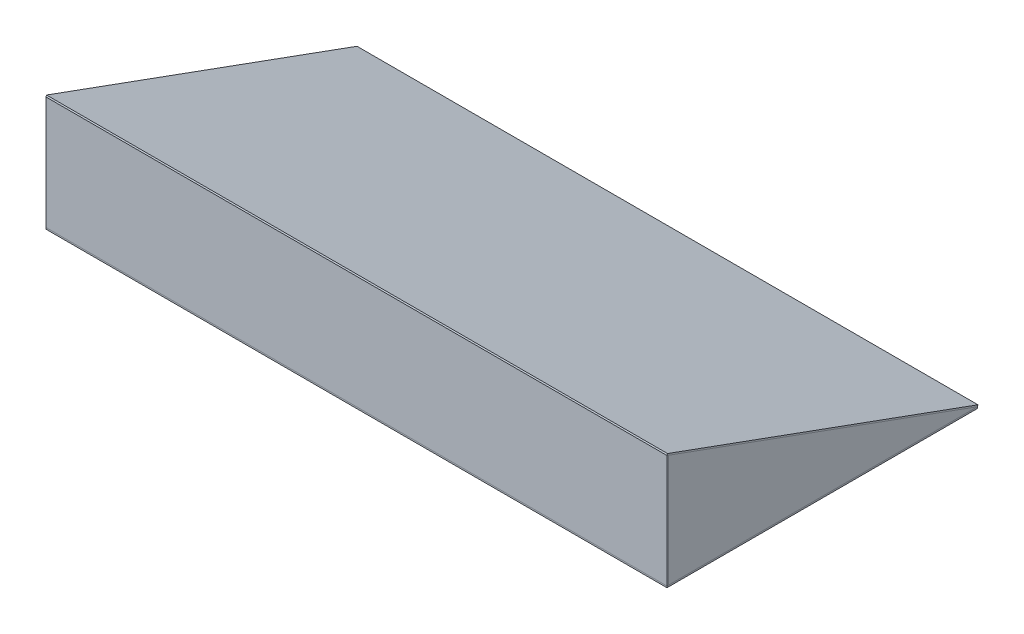
ISO-10303-21;
HEADER;
FILE_DESCRIPTION(('STEP AP214'),'2;1');
FILE_NAME('part.step','',(''),(''),'','','');
FILE_SCHEMA(('AUTOMOTIVE_DESIGN { 1 0 10303 214 1 1 1 1 }'));
ENDSEC;
DATA;
#1=APPLICATION_CONTEXT('core data for automotive mechanical design processes');
#2=APPLICATION_PROTOCOL_DEFINITION('international standard','automotive_design',2000,#1);
#3=PRODUCT_CONTEXT('',#1,'mechanical');
#4=PRODUCT('Part','Part','',(#3));
#5=PRODUCT_RELATED_PRODUCT_CATEGORY('part','',(#4));
#6=PRODUCT_DEFINITION_FORMATION('','',#4);
#7=PRODUCT_DEFINITION_CONTEXT('part definition',#1,'design');
#8=PRODUCT_DEFINITION('design','',#6,#7);
#9=PRODUCT_DEFINITION_SHAPE('','',#8);
#10=(LENGTH_UNIT() NAMED_UNIT(*) SI_UNIT(.MILLI.,.METRE.));
#11=(NAMED_UNIT(*) PLANE_ANGLE_UNIT() SI_UNIT($,.RADIAN.));
#12=(NAMED_UNIT(*) SI_UNIT($,.STERADIAN.) SOLID_ANGLE_UNIT());
#13=UNCERTAINTY_MEASURE_WITH_UNIT(LENGTH_MEASURE(1.E-05),#10,'distance_accuracy_value','');
#14=(GEOMETRIC_REPRESENTATION_CONTEXT(3) GLOBAL_UNCERTAINTY_ASSIGNED_CONTEXT((#13)) GLOBAL_UNIT_ASSIGNED_CONTEXT((#10,
#11,#12)) REPRESENTATION_CONTEXT('',''));
#15=CARTESIAN_POINT('',(0.,0.,0.));
#16=DIRECTION('',(0.,0.,1.));
#17=DIRECTION('',(1.,0.,0.));
#18=AXIS2_PLACEMENT_3D('',#15,#16,#17);
#19=CARTESIAN_POINT('',(299.2634,0.,-150.));
#20=DIRECTION('',(0.,-1.,0.));
#21=DIRECTION('',(0.,0.,-1.));
#22=AXIS2_PLACEMENT_3D('',#19,#20,#21);
#23=PLANE('',#22);
#24=DIRECTION('',(0.,0.,-1.));
#25=VECTOR('',#24,1.);
#26=CARTESIAN_POINT('',(300.,0.,-150.));
#27=LINE('',#26,#25);
#28=CARTESIAN_POINT('',(300.,0.,-0.7366));
#29=VERTEX_POINT('',#28);
#30=CARTESIAN_POINT('',(300.,0.,-150.));
#31=VERTEX_POINT('',#30);
#32=EDGE_CURVE('E103',#29,#31,#27,.T.);
#33=ORIENTED_EDGE('',*,*,#32,.F.);
#34=DIRECTION('',(1.,0.,0.));
#35=VECTOR('',#34,1.);
#36=CARTESIAN_POINT('',(299.2634,0.,-0.7366));
#37=LINE('',#36,#35);
#38=CARTESIAN_POINT('',(299.2634,0.,-0.7366));
#39=VERTEX_POINT('',#38);
#40=EDGE_CURVE('E12',#39,#29,#37,.T.);
#41=ORIENTED_EDGE('',*,*,#40,.F.);
#42=DIRECTION('',(0.,0.,-1.));
#43=VECTOR('',#42,1.);
#44=CARTESIAN_POINT('',(299.2634,0.,-150.));
#45=LINE('',#44,#43);
#46=CARTESIAN_POINT('',(299.2634,0.,-150.));
#47=VERTEX_POINT('',#46);
#48=EDGE_CURVE('E95',#39,#47,#45,.T.);
#49=ORIENTED_EDGE('',*,*,#48,.T.);
#50=DIRECTION('',(1.,0.,0.));
#51=VECTOR('',#50,1.);
#52=CARTESIAN_POINT('',(299.2634,0.,-150.));
#53=LINE('',#52,#51);
#54=EDGE_CURVE('E54',#47,#31,#53,.T.);
#55=ORIENTED_EDGE('',*,*,#54,.T.);
#56=EDGE_LOOP('',(#33,#41,#49,#55));
#57=FACE_BOUND('',#56,.T.);
#58=ADVANCED_FACE('F51',(#57),#23,.T.);
#59=CARTESIAN_POINT('',(299.2634,0.,-0.7366));
#60=DIRECTION('',(0.,0.,1.));
#61=DIRECTION('',(1.,0.,0.));
#62=AXIS2_PLACEMENT_3D('',#59,#60,#61);
#63=PLANE('',#62);
#64=DIRECTION('',(0.,-1.,0.));
#65=VECTOR('',#64,1.);
#66=CARTESIAN_POINT('',(300.,0.,-0.7366));
#67=LINE('',#66,#65);
#68=CARTESIAN_POINT('',(300.,54.5955351399293,-0.7366));
#69=VERTEX_POINT('',#68);
#70=EDGE_CURVE('E97',#69,#29,#67,.T.);
#71=ORIENTED_EDGE('',*,*,#70,.F.);
#72=DIRECTION('',(1.,0.,0.));
#73=VECTOR('',#72,1.);
#74=CARTESIAN_POINT('',(299.2634,54.5955351399293,-0.7366));
#75=LINE('',#74,#73);
#76=CARTESIAN_POINT('',(299.2634,54.5955351399293,-0.7366));
#77=VERTEX_POINT('',#76);
#78=EDGE_CURVE('E60',#77,#69,#75,.T.);
#79=ORIENTED_EDGE('',*,*,#78,.F.);
#80=DIRECTION('',(0.,-1.,0.));
#81=VECTOR('',#80,1.);
#82=CARTESIAN_POINT('',(299.2634,0.,-0.7366));
#83=LINE('',#82,#81);
#84=EDGE_CURVE('E92',#77,#39,#83,.T.);
#85=ORIENTED_EDGE('',*,*,#84,.T.);
#86=ORIENTED_EDGE('',*,*,#40,.T.);
#87=EDGE_LOOP('',(#71,#79,#85,#86));
#88=FACE_BOUND('',#87,.T.);
#89=ADVANCED_FACE('F107',(#88),#63,.T.);
#90=CARTESIAN_POINT('',(299.2634,54.5955351399293,-0.7366));
#91=DIRECTION('',(0.,0.939149294067638,-0.343509247986509));
#92=DIRECTION('',(0.,0.343509247986509,0.939149294067638));
#93=AXIS2_PLACEMENT_3D('',#90,#91,#92);
#94=PLANE('',#93);
#95=DIRECTION('',(0.,0.343509247986509,0.939149294067638));
#96=VECTOR('',#95,1.);
#97=CARTESIAN_POINT('',(300.,54.5955351399293,-0.7366));
#98=LINE('',#97,#96);
#99=EDGE_CURVE('E90',#31,#69,#98,.T.);
#100=ORIENTED_EDGE('',*,*,#99,.F.);
#101=ORIENTED_EDGE('',*,*,#54,.F.);
#102=DIRECTION('',(0.,0.343509247986509,0.939149294067638));
#103=VECTOR('',#102,1.);
#104=CARTESIAN_POINT('',(299.2634,54.5955351399293,-0.7366));
#105=LINE('',#104,#103);
#106=EDGE_CURVE('E88',#47,#77,#105,.T.);
#107=ORIENTED_EDGE('',*,*,#106,.T.);
#108=ORIENTED_EDGE('',*,*,#78,.T.);
#109=EDGE_LOOP('',(#100,#101,#107,#108));
#110=FACE_BOUND('',#109,.T.);
#111=ADVANCED_FACE('F87',(#110),#94,.T.);
#112=CARTESIAN_POINT('',(299.2634,0.,0.));
#113=DIRECTION('',(-1.,0.,0.));
#114=DIRECTION('',(0.,0.,1.));
#115=AXIS2_PLACEMENT_3D('',#112,#113,#114);
#116=PLANE('',#115);
#117=ORIENTED_EDGE('',*,*,#48,.F.);
#118=ORIENTED_EDGE('',*,*,#84,.F.);
#119=ORIENTED_EDGE('',*,*,#106,.F.);
#120=EDGE_LOOP('',(#117,#118,#119));
#121=FACE_BOUND('',#120,.T.);
#122=ADVANCED_FACE('F94',(#121),#116,.T.);
#123=CARTESIAN_POINT('',(300.,0.,0.));
#124=DIRECTION('',(-1.,0.,0.));
#125=DIRECTION('',(0.,0.,1.));
#126=AXIS2_PLACEMENT_3D('',#123,#124,#125);
#127=PLANE('',#126);
#128=ORIENTED_EDGE('',*,*,#32,.T.);
#129=ORIENTED_EDGE('',*,*,#99,.T.);
#130=ORIENTED_EDGE('',*,*,#70,.T.);
#131=EDGE_LOOP('',(#128,#129,#130));
#132=FACE_BOUND('',#131,.T.);
#133=ADVANCED_FACE('F106',(#132),#127,.F.);
#134=CLOSED_SHELL('',(#58,#89,#111,#122,#133));
#135=MANIFOLD_SOLID_BREP('B2',#134);
#136=CARTESIAN_POINT('',(0.7366,0.,-0.7366));
#137=DIRECTION('',(0.,0.,1.));
#138=DIRECTION('',(1.,0.,0.));
#139=AXIS2_PLACEMENT_3D('',#136,#137,#138);
#140=PLANE('',#139);
#141=DIRECTION('',(0.,1.,0.));
#142=VECTOR('',#141,1.);
#143=CARTESIAN_POINT('',(0.,0.,-0.7366));
#144=LINE('',#143,#142);
#145=CARTESIAN_POINT('',(0.,0.,-0.7366));
#146=VERTEX_POINT('',#145);
#147=CARTESIAN_POINT('',(0.,54.5955351399293,-0.7366));
#148=VERTEX_POINT('',#147);
#149=EDGE_CURVE('E220',#146,#148,#144,.T.);
#150=ORIENTED_EDGE('',*,*,#149,.F.);
#151=DIRECTION('',(-1.,0.,0.));
#152=VECTOR('',#151,1.);
#153=CARTESIAN_POINT('',(0.7366,0.,-0.7366));
#154=LINE('',#153,#152);
#155=CARTESIAN_POINT('',(0.7366,0.,-0.7366));
#156=VERTEX_POINT('',#155);
#157=EDGE_CURVE('E49',#156,#146,#154,.T.);
#158=ORIENTED_EDGE('',*,*,#157,.F.);
#159=DIRECTION('',(0.,1.,0.));
#160=VECTOR('',#159,1.);
#161=CARTESIAN_POINT('',(0.7366,0.,-0.7366));
#162=LINE('',#161,#160);
#163=CARTESIAN_POINT('',(0.7366,54.5955351399293,-0.7366));
#164=VERTEX_POINT('',#163);
#165=EDGE_CURVE('E212',#156,#164,#162,.T.);
#166=ORIENTED_EDGE('',*,*,#165,.T.);
#167=DIRECTION('',(-1.,0.,0.));
#168=VECTOR('',#167,1.);
#169=CARTESIAN_POINT('',(0.7366,54.5955351399293,-0.7366));
#170=LINE('',#169,#168);
#171=EDGE_CURVE('E171',#164,#148,#170,.T.);
#172=ORIENTED_EDGE('',*,*,#171,.T.);
#173=EDGE_LOOP('',(#150,#158,#166,#172));
#174=FACE_BOUND('',#173,.T.);
#175=ADVANCED_FACE('F168',(#174),#140,.T.);
#176=CARTESIAN_POINT('',(0.7366,0.,-150.));
#177=DIRECTION('',(0.,-1.,0.));
#178=DIRECTION('',(0.,0.,-1.));
#179=AXIS2_PLACEMENT_3D('',#176,#177,#178);
#180=PLANE('',#179);
#181=DIRECTION('',(0.,0.,1.));
#182=VECTOR('',#181,1.);
#183=CARTESIAN_POINT('',(0.,0.,-150.));
#184=LINE('',#183,#182);
#185=CARTESIAN_POINT('',(0.,0.,-150.));
#186=VERTEX_POINT('',#185);
#187=EDGE_CURVE('E214',#186,#146,#184,.T.);
#188=ORIENTED_EDGE('',*,*,#187,.F.);
#189=DIRECTION('',(-1.,0.,0.));
#190=VECTOR('',#189,1.);
#191=CARTESIAN_POINT('',(0.7366,0.,-150.));
#192=LINE('',#191,#190);
#193=CARTESIAN_POINT('',(0.7366,0.,-150.));
#194=VERTEX_POINT('',#193);
#195=EDGE_CURVE('E177',#194,#186,#192,.T.);
#196=ORIENTED_EDGE('',*,*,#195,.F.);
#197=DIRECTION('',(0.,0.,1.));
#198=VECTOR('',#197,1.);
#199=CARTESIAN_POINT('',(0.7366,0.,-150.));
#200=LINE('',#199,#198);
#201=EDGE_CURVE('E209',#194,#156,#200,.T.);
#202=ORIENTED_EDGE('',*,*,#201,.T.);
#203=ORIENTED_EDGE('',*,*,#157,.T.);
#204=EDGE_LOOP('',(#188,#196,#202,#203));
#205=FACE_BOUND('',#204,.T.);
#206=ADVANCED_FACE('F224',(#205),#180,.T.);
#207=CARTESIAN_POINT('',(0.7366,54.5955351399293,-0.7366));
#208=DIRECTION('',(0.,0.939149294067638,-0.343509247986509));
#209=DIRECTION('',(0.,0.343509247986509,0.939149294067638));
#210=AXIS2_PLACEMENT_3D('',#207,#208,#209);
#211=PLANE('',#210);
#212=DIRECTION('',(0.,-0.343509247986509,-0.939149294067638));
#213=VECTOR('',#212,1.);
#214=CARTESIAN_POINT('',(0.,54.5955351399293,-0.7366));
#215=LINE('',#214,#213);
#216=EDGE_CURVE('E207',#148,#186,#215,.T.);
#217=ORIENTED_EDGE('',*,*,#216,.F.);
#218=ORIENTED_EDGE('',*,*,#171,.F.);
#219=DIRECTION('',(0.,-0.343509247986509,-0.939149294067638));
#220=VECTOR('',#219,1.);
#221=CARTESIAN_POINT('',(0.7366,54.5955351399293,-0.7366));
#222=LINE('',#221,#220);
#223=EDGE_CURVE('E205',#164,#194,#222,.T.);
#224=ORIENTED_EDGE('',*,*,#223,.T.);
#225=ORIENTED_EDGE('',*,*,#195,.T.);
#226=EDGE_LOOP('',(#217,#218,#224,#225));
#227=FACE_BOUND('',#226,.T.);
#228=ADVANCED_FACE('F204',(#227),#211,.T.);
#229=CARTESIAN_POINT('',(0.7366,0.,0.));
#230=DIRECTION('',(1.,0.,0.));
#231=DIRECTION('',(0.,0.,-1.));
#232=AXIS2_PLACEMENT_3D('',#229,#230,#231);
#233=PLANE('',#232);
#234=ORIENTED_EDGE('',*,*,#165,.F.);
#235=ORIENTED_EDGE('',*,*,#201,.F.);
#236=ORIENTED_EDGE('',*,*,#223,.F.);
#237=EDGE_LOOP('',(#234,#235,#236));
#238=FACE_BOUND('',#237,.T.);
#239=ADVANCED_FACE('F211',(#238),#233,.T.);
#240=CARTESIAN_POINT('',(0.,0.,0.));
#241=DIRECTION('',(1.,0.,0.));
#242=DIRECTION('',(0.,0.,-1.));
#243=AXIS2_PLACEMENT_3D('',#240,#241,#242);
#244=PLANE('',#243);
#245=ORIENTED_EDGE('',*,*,#149,.T.);
#246=ORIENTED_EDGE('',*,*,#216,.T.);
#247=ORIENTED_EDGE('',*,*,#187,.T.);
#248=EDGE_LOOP('',(#245,#246,#247));
#249=FACE_BOUND('',#248,.T.);
#250=ADVANCED_FACE('F223',(#249),#244,.F.);
#251=CLOSED_SHELL('',(#175,#206,#228,#239,#250));
#252=MANIFOLD_SOLID_BREP('B6',#251);
#253=CARTESIAN_POINT('',(354.600503997447,0.,-0.7366));
#254=DIRECTION('',(0.,0.,1.));
#255=DIRECTION('',(1.,0.,0.));
#256=AXIS2_PLACEMENT_3D('',#253,#254,#255);
#257=PLANE('',#256);
#258=DIRECTION('',(0.,-1.,0.));
#259=VECTOR('',#258,1.);
#260=CARTESIAN_POINT('',(300.,0.,-0.7366));
#261=LINE('',#260,#259);
#262=CARTESIAN_POINT('',(300.,54.5955351399293,-0.7366));
#263=VERTEX_POINT('',#262);
#264=CARTESIAN_POINT('',(300.,0.,-0.7366));
#265=VERTEX_POINT('',#264);
#266=EDGE_CURVE('E326',#263,#265,#261,.T.);
#267=ORIENTED_EDGE('',*,*,#266,.T.);
#268=DIRECTION('',(-1.,0.,0.));
#269=VECTOR('',#268,1.);
#270=CARTESIAN_POINT('',(354.600503997447,0.,-0.7366));
#271=LINE('',#270,#269);
#272=CARTESIAN_POINT('',(0.,0.,-0.7366));
#273=VERTEX_POINT('',#272);
#274=EDGE_CURVE('E307',#265,#273,#271,.T.);
#275=ORIENTED_EDGE('',*,*,#274,.T.);
#276=DIRECTION('',(0.,1.,0.));
#277=VECTOR('',#276,1.);
#278=CARTESIAN_POINT('',(0.,0.,-0.7366));
#279=LINE('',#278,#277);
#280=CARTESIAN_POINT('',(0.,54.5955351399293,-0.7366));
#281=VERTEX_POINT('',#280);
#282=EDGE_CURVE('E352',#273,#281,#279,.T.);
#283=ORIENTED_EDGE('',*,*,#282,.T.);
#284=DIRECTION('',(-1.,0.,0.));
#285=VECTOR('',#284,1.);
#286=CARTESIAN_POINT('',(354.600503997447,54.5955351399293,-0.7366));
#287=LINE('',#286,#285);
#288=EDGE_CURVE('E166',#263,#281,#287,.T.);
#289=ORIENTED_EDGE('',*,*,#288,.F.);
#290=EDGE_LOOP('',(#267,#275,#283,#289));
#291=FACE_BOUND('',#290,.T.);
#292=ADVANCED_FACE('F285',(#291),#257,.F.);
#293=CARTESIAN_POINT('',(354.600503997447,54.5955351399293,0.));
#294=DIRECTION('',(0.,1.,0.));
#295=DIRECTION('',(0.,0.,1.));
#296=AXIS2_PLACEMENT_3D('',#293,#294,#295);
#297=PLANE('',#296);
#298=DIRECTION('',(-1.,0.,0.));
#299=VECTOR('',#298,1.);
#300=CARTESIAN_POINT('',(354.600503997447,54.5955351399293,0.));
#301=LINE('',#300,#299);
#302=CARTESIAN_POINT('',(300.,54.5955351399293,0.));
#303=VERTEX_POINT('',#302);
#304=CARTESIAN_POINT('',(0.,54.5955351399293,0.));
#305=VERTEX_POINT('',#304);
#306=EDGE_CURVE('E292',#303,#305,#301,.T.);
#307=ORIENTED_EDGE('',*,*,#306,.F.);
#308=DIRECTION('',(0.,0.,-1.));
#309=VECTOR('',#308,1.);
#310=CARTESIAN_POINT('',(300.,54.5955351399293,-0.7366));
#311=LINE('',#310,#309);
#312=EDGE_CURVE('E324',#263,#303,#311,.F.);
#313=ORIENTED_EDGE('',*,*,#312,.F.);
#314=ORIENTED_EDGE('',*,*,#288,.T.);
#315=DIRECTION('',(0.,0.,-1.));
#316=VECTOR('',#315,1.);
#317=CARTESIAN_POINT('',(0.,54.5955351399293,0.));
#318=LINE('',#317,#316);
#319=EDGE_CURVE('E341',#305,#281,#318,.T.);
#320=ORIENTED_EDGE('',*,*,#319,.F.);
#321=EDGE_LOOP('',(#307,#313,#314,#320));
#322=FACE_BOUND('',#321,.T.);
#323=ADVANCED_FACE('F339',(#322),#297,.T.);
#324=CARTESIAN_POINT('',(354.600503997447,0.,0.));
#325=DIRECTION('',(0.,0.,1.));
#326=DIRECTION('',(1.,0.,0.));
#327=AXIS2_PLACEMENT_3D('',#324,#325,#326);
#328=PLANE('',#327);
#329=DIRECTION('',(-1.,0.,0.));
#330=VECTOR('',#329,1.);
#331=CARTESIAN_POINT('',(354.600503997447,0.,0.));
#332=LINE('',#331,#330);
#333=CARTESIAN_POINT('',(300.,0.,0.));
#334=VERTEX_POINT('',#333);
#335=CARTESIAN_POINT('',(0.,0.,0.));
#336=VERTEX_POINT('',#335);
#337=EDGE_CURVE('E337',#334,#336,#332,.T.);
#338=ORIENTED_EDGE('',*,*,#337,.F.);
#339=DIRECTION('',(0.,1.,0.));
#340=VECTOR('',#339,1.);
#341=CARTESIAN_POINT('',(300.,0.,0.));
#342=LINE('',#341,#340);
#343=EDGE_CURVE('E299',#303,#334,#342,.F.);
#344=ORIENTED_EDGE('',*,*,#343,.F.);
#345=ORIENTED_EDGE('',*,*,#306,.T.);
#346=DIRECTION('',(0.,1.,0.));
#347=VECTOR('',#346,1.);
#348=CARTESIAN_POINT('',(0.,0.,0.));
#349=LINE('',#348,#347);
#350=EDGE_CURVE('E349',#336,#305,#349,.T.);
#351=ORIENTED_EDGE('',*,*,#350,.F.);
#352=EDGE_LOOP('',(#338,#344,#345,#351));
#353=FACE_BOUND('',#352,.T.);
#354=ADVANCED_FACE('F334',(#353),#328,.T.);
#355=CARTESIAN_POINT('',(354.600503997447,0.,-0.7366));
#356=DIRECTION('',(0.,-1.,0.));
#357=DIRECTION('',(0.,0.,-1.));
#358=AXIS2_PLACEMENT_3D('',#355,#356,#357);
#359=PLANE('',#358);
#360=ORIENTED_EDGE('',*,*,#274,.F.);
#361=DIRECTION('',(0.,0.,-1.));
#362=VECTOR('',#361,1.);
#363=CARTESIAN_POINT('',(300.,0.,-0.7366));
#364=LINE('',#363,#362);
#365=EDGE_CURVE('E330',#265,#334,#364,.F.);
#366=ORIENTED_EDGE('',*,*,#365,.T.);
#367=ORIENTED_EDGE('',*,*,#337,.T.);
#368=DIRECTION('',(0.,0.,1.));
#369=VECTOR('',#368,1.);
#370=CARTESIAN_POINT('',(0.,0.,-0.7366));
#371=LINE('',#370,#369);
#372=EDGE_CURVE('E346',#273,#336,#371,.T.);
#373=ORIENTED_EDGE('',*,*,#372,.F.);
#374=EDGE_LOOP('',(#360,#366,#367,#373));
#375=FACE_BOUND('',#374,.T.);
#376=ADVANCED_FACE('F357',(#375),#359,.T.);
#377=CARTESIAN_POINT('',(0.,0.,0.));
#378=DIRECTION('',(-1.,0.,0.));
#379=DIRECTION('',(0.,0.,1.));
#380=AXIS2_PLACEMENT_3D('',#377,#378,#379);
#381=PLANE('',#380);
#382=ORIENTED_EDGE('',*,*,#282,.F.);
#383=ORIENTED_EDGE('',*,*,#372,.T.);
#384=ORIENTED_EDGE('',*,*,#350,.T.);
#385=ORIENTED_EDGE('',*,*,#319,.T.);
#386=EDGE_LOOP('',(#382,#383,#384,#385));
#387=FACE_BOUND('',#386,.T.);
#388=ADVANCED_FACE('F359',(#387),#381,.T.);
#389=CARTESIAN_POINT('',(300.,0.,-0.7366));
#390=DIRECTION('',(-1.,0.,0.));
#391=DIRECTION('',(0.,-1.,0.));
#392=AXIS2_PLACEMENT_3D('',#389,#390,#391);
#393=PLANE('',#392);
#394=ORIENTED_EDGE('',*,*,#365,.F.);
#395=ORIENTED_EDGE('',*,*,#266,.F.);
#396=ORIENTED_EDGE('',*,*,#312,.T.);
#397=ORIENTED_EDGE('',*,*,#343,.T.);
#398=EDGE_LOOP('',(#394,#395,#396,#397));
#399=FACE_BOUND('',#398,.T.);
#400=ADVANCED_FACE('F325',(#399),#393,.F.);
#401=CLOSED_SHELL('',(#292,#323,#354,#376,#388,#400));
#402=MANIFOLD_SOLID_BREP('B43',#401);
#403=CARTESIAN_POINT('',(460.101137595332,0.692177584470902,-150.251932037574));
#404=DIRECTION('',(0.,-0.939692620785911,0.342020143325663));
#405=DIRECTION('',(0.,-0.342020143325663,-0.939692620785911));
#406=AXIS2_PLACEMENT_3D('',#403,#404,#405);
#407=PLANE('',#406);
#408=DIRECTION('',(0.,-0.342020143325663,-0.939692620785911));
#409=VECTOR('',#408,1.);
#410=CARTESIAN_POINT('',(300.,0.692177584470902,-150.251932037574));
#411=LINE('',#410,#409);
#412=CARTESIAN_POINT('',(300.,55.2877127244002,-0.251932037573677));
#413=VERTEX_POINT('',#412);
#414=CARTESIAN_POINT('',(300.,0.692177584470902,-150.251932037574));
#415=VERTEX_POINT('',#414);
#416=EDGE_CURVE('E470',#413,#415,#411,.T.);
#417=ORIENTED_EDGE('',*,*,#416,.T.);
#418=DIRECTION('',(-1.,0.,0.));
#419=VECTOR('',#418,1.);
#420=CARTESIAN_POINT('',(460.101137595332,0.692177584470902,-150.251932037574));
#421=LINE('',#420,#419);
#422=CARTESIAN_POINT('',(0.,0.692177584470902,-150.251932037574));
#423=VERTEX_POINT('',#422);
#424=EDGE_CURVE('E451',#415,#423,#421,.T.);
#425=ORIENTED_EDGE('',*,*,#424,.T.);
#426=DIRECTION('',(0.,0.342020143325663,0.939692620785911));
#427=VECTOR('',#426,1.);
#428=CARTESIAN_POINT('',(0.,0.692177584470902,-150.251932037574));
#429=LINE('',#428,#427);
#430=CARTESIAN_POINT('',(0.,55.2877127244002,-0.251932037573677));
#431=VERTEX_POINT('',#430);
#432=EDGE_CURVE('E496',#423,#431,#429,.T.);
#433=ORIENTED_EDGE('',*,*,#432,.T.);
#434=DIRECTION('',(-1.,0.,0.));
#435=VECTOR('',#434,1.);
#436=CARTESIAN_POINT('',(460.101137595332,55.2877127244002,-0.251932037573677));
#437=LINE('',#436,#435);
#438=EDGE_CURVE('E283',#413,#431,#437,.T.);
#439=ORIENTED_EDGE('',*,*,#438,.F.);
#440=EDGE_LOOP('',(#417,#425,#433,#439));
#441=FACE_BOUND('',#440,.T.);
#442=ADVANCED_FACE('F429',(#441),#407,.F.);
#443=CARTESIAN_POINT('',(460.101137595332,54.5955351399293,0.));
#444=DIRECTION('',(0.,0.342020143325654,0.939692620785914));
#445=DIRECTION('',(0.,-0.939692620785914,0.342020143325654));
#446=AXIS2_PLACEMENT_3D('',#443,#444,#445);
#447=PLANE('',#446);
#448=DIRECTION('',(-1.,0.,0.));
#449=VECTOR('',#448,1.);
#450=CARTESIAN_POINT('',(460.101137595332,54.5955351399293,0.));
#451=LINE('',#450,#449);
#452=CARTESIAN_POINT('',(300.,54.5955351399293,0.));
#453=VERTEX_POINT('',#452);
#454=CARTESIAN_POINT('',(0.,54.5955351399293,0.));
#455=VERTEX_POINT('',#454);
#456=EDGE_CURVE('E436',#453,#455,#451,.T.);
#457=ORIENTED_EDGE('',*,*,#456,.F.);
#458=DIRECTION('',(0.,0.939692620785911,-0.342020143325663));
#459=VECTOR('',#458,1.);
#460=CARTESIAN_POINT('',(300.,55.2877127244002,-0.251932037573677));
#461=LINE('',#460,#459);
#462=EDGE_CURVE('E468',#413,#453,#461,.F.);
#463=ORIENTED_EDGE('',*,*,#462,.F.);
#464=ORIENTED_EDGE('',*,*,#438,.T.);
#465=DIRECTION('',(0.,0.939692620785914,-0.342020143325654));
#466=VECTOR('',#465,1.);
#467=CARTESIAN_POINT('',(0.,54.5955351399293,0.));
#468=LINE('',#467,#466);
#469=EDGE_CURVE('E485',#455,#431,#468,.T.);
#470=ORIENTED_EDGE('',*,*,#469,.F.);
#471=EDGE_LOOP('',(#457,#463,#464,#470));
#472=FACE_BOUND('',#471,.T.);
#473=ADVANCED_FACE('F483',(#472),#447,.T.);
#474=CARTESIAN_POINT('',(460.101137595332,0.,-150.));
#475=DIRECTION('',(0.,-0.93969262078591,0.342020143325663));
#476=DIRECTION('',(0.,-0.342020143325663,-0.939692620785911));
#477=AXIS2_PLACEMENT_3D('',#474,#475,#476);
#478=PLANE('',#477);
#479=DIRECTION('',(-1.,0.,0.));
#480=VECTOR('',#479,1.);
#481=CARTESIAN_POINT('',(460.101137595332,0.,-150.));
#482=LINE('',#481,#480);
#483=CARTESIAN_POINT('',(300.,0.,-150.));
#484=VERTEX_POINT('',#483);
#485=CARTESIAN_POINT('',(0.,0.,-150.));
#486=VERTEX_POINT('',#485);
#487=EDGE_CURVE('E481',#484,#486,#482,.T.);
#488=ORIENTED_EDGE('',*,*,#487,.F.);
#489=DIRECTION('',(0.,-0.342020143325663,-0.939692620785911));
#490=VECTOR('',#489,1.);
#491=CARTESIAN_POINT('',(300.,0.,-150.));
#492=LINE('',#491,#490);
#493=EDGE_CURVE('E443',#453,#484,#492,.T.);
#494=ORIENTED_EDGE('',*,*,#493,.F.);
#495=ORIENTED_EDGE('',*,*,#456,.T.);
#496=DIRECTION('',(0.,0.342020143325663,0.93969262078591));
#497=VECTOR('',#496,1.);
#498=CARTESIAN_POINT('',(0.,0.,-150.));
#499=LINE('',#498,#497);
#500=EDGE_CURVE('E493',#486,#455,#499,.T.);
#501=ORIENTED_EDGE('',*,*,#500,.F.);
#502=EDGE_LOOP('',(#488,#494,#495,#501));
#503=FACE_BOUND('',#502,.T.);
#504=ADVANCED_FACE('F478',(#503),#478,.T.);
#505=CARTESIAN_POINT('',(460.101137595332,0.692177584470902,-150.251932037574));
#506=DIRECTION('',(0.,-0.342020143325655,-0.939692620785913));
#507=DIRECTION('',(0.,0.939692620785914,-0.342020143325655));
#508=AXIS2_PLACEMENT_3D('',#505,#506,#507);
#509=PLANE('',#508);
#510=ORIENTED_EDGE('',*,*,#424,.F.);
#511=DIRECTION('',(0.,0.939692620785911,-0.342020143325663));
#512=VECTOR('',#511,1.);
#513=CARTESIAN_POINT('',(300.,0.692177584470902,-150.251932037574));
#514=LINE('',#513,#512);
#515=EDGE_CURVE('E474',#415,#484,#514,.F.);
#516=ORIENTED_EDGE('',*,*,#515,.T.);
#517=ORIENTED_EDGE('',*,*,#487,.T.);
#518=DIRECTION('',(0.,-0.939692620785913,0.342020143325655));
#519=VECTOR('',#518,1.);
#520=CARTESIAN_POINT('',(0.,0.692177584470902,-150.251932037574));
#521=LINE('',#520,#519);
#522=EDGE_CURVE('E490',#423,#486,#521,.T.);
#523=ORIENTED_EDGE('',*,*,#522,.F.);
#524=EDGE_LOOP('',(#510,#516,#517,#523));
#525=FACE_BOUND('',#524,.T.);
#526=ADVANCED_FACE('F501',(#525),#509,.T.);
#527=CARTESIAN_POINT('',(0.,0.,0.));
#528=DIRECTION('',(-1.,0.,0.));
#529=DIRECTION('',(0.,0.,1.));
#530=AXIS2_PLACEMENT_3D('',#527,#528,#529);
#531=PLANE('',#530);
#532=ORIENTED_EDGE('',*,*,#432,.F.);
#533=ORIENTED_EDGE('',*,*,#522,.T.);
#534=ORIENTED_EDGE('',*,*,#500,.T.);
#535=ORIENTED_EDGE('',*,*,#469,.T.);
#536=EDGE_LOOP('',(#532,#533,#534,#535));
#537=FACE_BOUND('',#536,.T.);
#538=ADVANCED_FACE('F503',(#537),#531,.T.);
#539=CARTESIAN_POINT('',(300.,0.692177584470902,-150.251932037574));
#540=DIRECTION('',(-1.,0.,0.));
#541=DIRECTION('',(0.,-0.342020143325663,-0.939692620785911));
#542=AXIS2_PLACEMENT_3D('',#539,#540,#541);
#543=PLANE('',#542);
#544=ORIENTED_EDGE('',*,*,#515,.F.);
#545=ORIENTED_EDGE('',*,*,#416,.F.);
#546=ORIENTED_EDGE('',*,*,#462,.T.);
#547=ORIENTED_EDGE('',*,*,#493,.T.);
#548=EDGE_LOOP('',(#544,#545,#546,#547));
#549=FACE_BOUND('',#548,.T.);
#550=ADVANCED_FACE('F469',(#549),#543,.F.);
#551=CLOSED_SHELL('',(#442,#473,#504,#526,#538,#550));
#552=MANIFOLD_SOLID_BREP('B160',#551);
#553=CARTESIAN_POINT('',(300.,-0.7366,0.));
#554=DIRECTION('',(0.,1.,0.));
#555=DIRECTION('',(0.,0.,1.));
#556=AXIS2_PLACEMENT_3D('',#553,#554,#555);
#557=PLANE('',#556);
#558=DIRECTION('',(0.,0.,-1.));
#559=VECTOR('',#558,1.);
#560=CARTESIAN_POINT('',(0.,-0.7366,0.));
#561=LINE('',#560,#559);
#562=CARTESIAN_POINT('',(0.,-0.7366,0.));
#563=VERTEX_POINT('',#562);
#564=CARTESIAN_POINT('',(0.,-0.7366,-150.));
#565=VERTEX_POINT('',#564);
#566=EDGE_CURVE('E627',#563,#565,#561,.T.);
#567=ORIENTED_EDGE('',*,*,#566,.T.);
#568=DIRECTION('',(-1.,0.,0.));
#569=VECTOR('',#568,1.);
#570=CARTESIAN_POINT('',(300.,-0.7366,-150.));
#571=LINE('',#570,#569);
#572=CARTESIAN_POINT('',(300.,-0.7366,-150.));
#573=VERTEX_POINT('',#572);
#574=EDGE_CURVE('E427',#573,#565,#571,.T.);
#575=ORIENTED_EDGE('',*,*,#574,.F.);
#576=DIRECTION('',(0.,0.,-1.));
#577=VECTOR('',#576,1.);
#578=CARTESIAN_POINT('',(300.,-0.7366,0.));
#579=LINE('',#578,#577);
#580=CARTESIAN_POINT('',(300.,-0.7366,0.));
#581=VERTEX_POINT('',#580);
#582=EDGE_CURVE('E604',#581,#573,#579,.T.);
#583=ORIENTED_EDGE('',*,*,#582,.F.);
#584=DIRECTION('',(-1.,0.,0.));
#585=VECTOR('',#584,1.);
#586=CARTESIAN_POINT('',(300.,-0.7366,0.));
#587=LINE('',#586,#585);
#588=EDGE_CURVE('E580',#581,#563,#587,.T.);
#589=ORIENTED_EDGE('',*,*,#588,.T.);
#590=EDGE_LOOP('',(#567,#575,#583,#589));
#591=FACE_BOUND('',#590,.T.);
#592=ADVANCED_FACE('F564',(#591),#557,.F.);
#593=CARTESIAN_POINT('',(300.,0.,-150.));
#594=DIRECTION('',(0.,0.,-1.));
#595=DIRECTION('',(-1.,0.,0.));
#596=AXIS2_PLACEMENT_3D('',#593,#594,#595);
#597=PLANE('',#596);
#598=DIRECTION('',(0.,-1.,0.));
#599=VECTOR('',#598,1.);
#600=CARTESIAN_POINT('',(0.,0.,-150.));
#601=LINE('',#600,#599);
#602=CARTESIAN_POINT('',(0.,0.,-150.));
#603=VERTEX_POINT('',#602);
#604=EDGE_CURVE('E613',#603,#565,#601,.T.);
#605=ORIENTED_EDGE('',*,*,#604,.F.);
#606=DIRECTION('',(-1.,0.,0.));
#607=VECTOR('',#606,1.);
#608=CARTESIAN_POINT('',(300.,0.,-150.));
#609=LINE('',#608,#607);
#610=CARTESIAN_POINT('',(300.,0.,-150.));
#611=VERTEX_POINT('',#610);
#612=EDGE_CURVE('E572',#611,#603,#609,.T.);
#613=ORIENTED_EDGE('',*,*,#612,.F.);
#614=DIRECTION('',(0.,-1.,0.));
#615=VECTOR('',#614,1.);
#616=CARTESIAN_POINT('',(300.,0.,-150.));
#617=LINE('',#616,#615);
#618=EDGE_CURVE('E611',#611,#573,#617,.T.);
#619=ORIENTED_EDGE('',*,*,#618,.T.);
#620=ORIENTED_EDGE('',*,*,#574,.T.);
#621=EDGE_LOOP('',(#605,#613,#619,#620));
#622=FACE_BOUND('',#621,.T.);
#623=ADVANCED_FACE('F610',(#622),#597,.T.);
#624=CARTESIAN_POINT('',(300.,0.,0.));
#625=DIRECTION('',(0.,1.,0.));
#626=DIRECTION('',(0.,0.,1.));
#627=AXIS2_PLACEMENT_3D('',#624,#625,#626);
#628=PLANE('',#627);
#629=DIRECTION('',(0.,0.,-1.));
#630=VECTOR('',#629,1.);
#631=CARTESIAN_POINT('',(0.,0.,0.));
#632=LINE('',#631,#630);
#633=CARTESIAN_POINT('',(0.,0.,0.));
#634=VERTEX_POINT('',#633);
#635=EDGE_CURVE('E630',#634,#603,#632,.T.);
#636=ORIENTED_EDGE('',*,*,#635,.F.);
#637=DIRECTION('',(-1.,0.,0.));
#638=VECTOR('',#637,1.);
#639=CARTESIAN_POINT('',(300.,0.,0.));
#640=LINE('',#639,#638);
#641=CARTESIAN_POINT('',(300.,0.,0.));
#642=VERTEX_POINT('',#641);
#643=EDGE_CURVE('E593',#642,#634,#640,.T.);
#644=ORIENTED_EDGE('',*,*,#643,.F.);
#645=DIRECTION('',(0.,0.,-1.));
#646=VECTOR('',#645,1.);
#647=CARTESIAN_POINT('',(300.,0.,0.));
#648=LINE('',#647,#646);
#649=EDGE_CURVE('E619',#642,#611,#648,.T.);
#650=ORIENTED_EDGE('',*,*,#649,.T.);
#651=ORIENTED_EDGE('',*,*,#612,.T.);
#652=EDGE_LOOP('',(#636,#644,#650,#651));
#653=FACE_BOUND('',#652,.T.);
#654=ADVANCED_FACE('F621',(#653),#628,.T.);
#655=CARTESIAN_POINT('',(300.,-0.7366,0.));
#656=DIRECTION('',(0.,0.,1.));
#657=DIRECTION('',(1.,0.,0.));
#658=AXIS2_PLACEMENT_3D('',#655,#656,#657);
#659=PLANE('',#658);
#660=DIRECTION('',(0.,1.,0.));
#661=VECTOR('',#660,1.);
#662=CARTESIAN_POINT('',(0.,-0.7366,0.));
#663=LINE('',#662,#661);
#664=EDGE_CURVE('E632',#563,#634,#663,.T.);
#665=ORIENTED_EDGE('',*,*,#664,.F.);
#666=ORIENTED_EDGE('',*,*,#588,.F.);
#667=DIRECTION('',(0.,1.,0.));
#668=VECTOR('',#667,1.);
#669=CARTESIAN_POINT('',(300.,-0.7366,0.));
#670=LINE('',#669,#668);
#671=EDGE_CURVE('E622',#581,#642,#670,.T.);
#672=ORIENTED_EDGE('',*,*,#671,.T.);
#673=ORIENTED_EDGE('',*,*,#643,.T.);
#674=EDGE_LOOP('',(#665,#666,#672,#673));
#675=FACE_BOUND('',#674,.T.);
#676=ADVANCED_FACE('F638',(#675),#659,.T.);
#677=CARTESIAN_POINT('',(300.,0.,0.));
#678=DIRECTION('',(-1.,0.,0.));
#679=DIRECTION('',(0.,0.,1.));
#680=AXIS2_PLACEMENT_3D('',#677,#678,#679);
#681=PLANE('',#680);
#682=ORIENTED_EDGE('',*,*,#582,.T.);
#683=ORIENTED_EDGE('',*,*,#618,.F.);
#684=ORIENTED_EDGE('',*,*,#649,.F.);
#685=ORIENTED_EDGE('',*,*,#671,.F.);
#686=EDGE_LOOP('',(#682,#683,#684,#685));
#687=FACE_BOUND('',#686,.T.);
#688=ADVANCED_FACE('F618',(#687),#681,.F.);
#689=CARTESIAN_POINT('',(0.,0.,0.));
#690=DIRECTION('',(-1.,0.,0.));
#691=DIRECTION('',(0.,0.,1.));
#692=AXIS2_PLACEMENT_3D('',#689,#690,#691);
#693=PLANE('',#692);
#694=ORIENTED_EDGE('',*,*,#566,.F.);
#695=ORIENTED_EDGE('',*,*,#664,.T.);
#696=ORIENTED_EDGE('',*,*,#635,.T.);
#697=ORIENTED_EDGE('',*,*,#604,.T.);
#698=EDGE_LOOP('',(#694,#695,#696,#697));
#699=FACE_BOUND('',#698,.T.);
#700=ADVANCED_FACE('F637',(#699),#693,.T.);
#701=CLOSED_SHELL('',(#592,#623,#654,#676,#688,#700));
#702=MANIFOLD_SOLID_BREP('B277',#701);
#703=ADVANCED_BREP_SHAPE_REPRESENTATION('',(#18,#135,#252,#402,#552,#702),#14);
#704=SHAPE_DEFINITION_REPRESENTATION(#9,#703);
ENDSEC;
END-ISO-10303-21;
